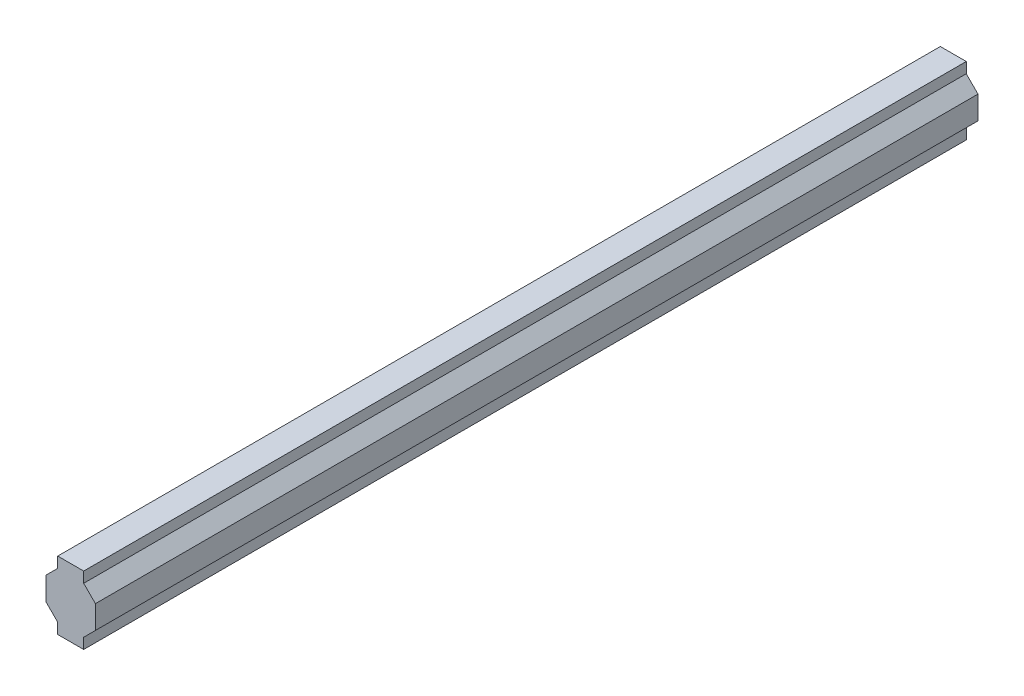
ISO-10303-21;
HEADER;
FILE_DESCRIPTION(('STEP AP214'),'2;1');
FILE_NAME('part.step','',(''),(''),'','','');
FILE_SCHEMA(('AUTOMOTIVE_DESIGN { 1 0 10303 214 1 1 1 1 }'));
ENDSEC;
DATA;
#1=APPLICATION_CONTEXT('core data for automotive mechanical design processes');
#2=APPLICATION_PROTOCOL_DEFINITION('international standard','automotive_design',2000,#1);
#3=PRODUCT_CONTEXT('',#1,'mechanical');
#4=PRODUCT('Part','Part','',(#3));
#5=PRODUCT_RELATED_PRODUCT_CATEGORY('part','',(#4));
#6=PRODUCT_DEFINITION_FORMATION('','',#4);
#7=PRODUCT_DEFINITION_CONTEXT('part definition',#1,'design');
#8=PRODUCT_DEFINITION('design','',#6,#7);
#9=PRODUCT_DEFINITION_SHAPE('','',#8);
#10=(LENGTH_UNIT() NAMED_UNIT(*) SI_UNIT(.MILLI.,.METRE.));
#11=(NAMED_UNIT(*) PLANE_ANGLE_UNIT() SI_UNIT($,.RADIAN.));
#12=(NAMED_UNIT(*) SI_UNIT($,.STERADIAN.) SOLID_ANGLE_UNIT());
#13=UNCERTAINTY_MEASURE_WITH_UNIT(LENGTH_MEASURE(1.E-05),#10,'distance_accuracy_value','');
#14=(GEOMETRIC_REPRESENTATION_CONTEXT(3) GLOBAL_UNCERTAINTY_ASSIGNED_CONTEXT((#13)) GLOBAL_UNIT_ASSIGNED_CONTEXT((#10,
#11,#12)) REPRESENTATION_CONTEXT('',''));
#15=CARTESIAN_POINT('',(0.,0.,0.));
#16=DIRECTION('',(0.,0.,1.));
#17=DIRECTION('',(1.,0.,0.));
#18=AXIS2_PLACEMENT_3D('',#15,#16,#17);
#19=CARTESIAN_POINT('',(-39.550290087148,0.0297695452971111,316.106580091162));
#20=DIRECTION('',(1.,0.,0.));
#21=DIRECTION('',(0.,0.,-1.));
#22=AXIS2_PLACEMENT_3D('',#19,#20,#21);
#23=PLANE('',#22);
#24=DIRECTION('',(0.,-1.,0.));
#25=VECTOR('',#24,1.);
#26=CARTESIAN_POINT('',(-39.550290087148,0.0297695452971111,116.106580091162));
#27=LINE('',#26,#25);
#28=CARTESIAN_POINT('',(-39.550290087148,5.29423563936438,116.106580091162));
#29=VERTEX_POINT('',#28);
#30=CARTESIAN_POINT('',(-39.550290087148,0.0297695452971111,116.106580091162));
#31=VERTEX_POINT('',#30);
#32=EDGE_CURVE('E157',#29,#31,#27,.T.);
#33=ORIENTED_EDGE('',*,*,#32,.T.);
#34=DIRECTION('',(0.,0.,-1.));
#35=VECTOR('',#34,1.);
#36=CARTESIAN_POINT('',(-39.550290087148,0.0297695452971111,316.106580091162));
#37=LINE('',#36,#35);
#38=CARTESIAN_POINT('',(-39.550290087148,0.0297695452971111,316.106580091162));
#39=VERTEX_POINT('',#38);
#40=EDGE_CURVE('E11',#39,#31,#37,.T.);
#41=ORIENTED_EDGE('',*,*,#40,.F.);
#42=DIRECTION('',(0.,-1.,0.));
#43=VECTOR('',#42,1.);
#44=CARTESIAN_POINT('',(-39.550290087148,0.0297695452971111,316.106580091162));
#45=LINE('',#44,#43);
#46=CARTESIAN_POINT('',(-39.550290087148,5.29423563936438,316.106580091162));
#47=VERTEX_POINT('',#46);
#48=EDGE_CURVE('E179',#47,#39,#45,.T.);
#49=ORIENTED_EDGE('',*,*,#48,.F.);
#50=DIRECTION('',(0.,0.,-1.));
#51=VECTOR('',#50,1.);
#52=CARTESIAN_POINT('',(-39.550290087148,5.29423563936438,316.106580091162));
#53=LINE('',#52,#51);
#54=EDGE_CURVE('E153',#47,#29,#53,.T.);
#55=ORIENTED_EDGE('',*,*,#54,.T.);
#56=EDGE_LOOP('',(#33,#41,#49,#55));
#57=FACE_BOUND('',#56,.T.);
#58=ADVANCED_FACE('F37',(#57),#23,.F.);
#59=CARTESIAN_POINT('',(-36.8896299153682,-2.63089062648271,316.106580091162));
#60=DIRECTION('',(0.707106781186547,0.707106781186547,0.));
#61=DIRECTION('',(-0.707106781186548,0.707106781186548,0.));
#62=AXIS2_PLACEMENT_3D('',#59,#60,#61);
#63=PLANE('',#62);
#64=DIRECTION('',(0.707106781186547,-0.707106781186547,0.));
#65=VECTOR('',#64,1.);
#66=CARTESIAN_POINT('',(-36.8896299153682,-2.63089062648271,116.106580091162));
#67=LINE('',#66,#65);
#68=CARTESIAN_POINT('',(-36.8896299153682,-2.63089062648271,116.106580091162));
#69=VERTEX_POINT('',#68);
#70=EDGE_CURVE('E160',#31,#69,#67,.T.);
#71=ORIENTED_EDGE('',*,*,#70,.T.);
#72=DIRECTION('',(0.,0.,-1.));
#73=VECTOR('',#72,1.);
#74=CARTESIAN_POINT('',(-36.8896299153682,-2.63089062648271,316.106580091162));
#75=LINE('',#74,#73);
#76=CARTESIAN_POINT('',(-36.8896299153682,-2.63089062648271,316.106580091162));
#77=VERTEX_POINT('',#76);
#78=EDGE_CURVE('E45',#77,#69,#75,.T.);
#79=ORIENTED_EDGE('',*,*,#78,.F.);
#80=DIRECTION('',(0.707106781186547,-0.707106781186547,0.));
#81=VECTOR('',#80,1.);
#82=CARTESIAN_POINT('',(-36.8896299153682,-2.63089062648271,316.106580091162));
#83=LINE('',#82,#81);
#84=EDGE_CURVE('E108',#39,#77,#83,.T.);
#85=ORIENTED_EDGE('',*,*,#84,.F.);
#86=ORIENTED_EDGE('',*,*,#40,.T.);
#87=EDGE_LOOP('',(#71,#79,#85,#86));
#88=FACE_BOUND('',#87,.T.);
#89=ADVANCED_FACE('F257',(#88),#63,.F.);
#90=CARTESIAN_POINT('',(-36.8896299153682,-5.03799740766926,316.106580091162));
#91=DIRECTION('',(1.,0.,0.));
#92=DIRECTION('',(0.,0.,-1.));
#93=AXIS2_PLACEMENT_3D('',#90,#91,#92);
#94=PLANE('',#93);
#95=DIRECTION('',(0.,-1.,0.));
#96=VECTOR('',#95,1.);
#97=CARTESIAN_POINT('',(-36.8896299153682,-5.03799740766926,116.106580091162));
#98=LINE('',#97,#96);
#99=CARTESIAN_POINT('',(-36.8896299153682,-5.03799740766926,116.106580091162));
#100=VERTEX_POINT('',#99);
#101=EDGE_CURVE('E162',#69,#100,#98,.T.);
#102=ORIENTED_EDGE('',*,*,#101,.T.);
#103=DIRECTION('',(0.,0.,-1.));
#104=VECTOR('',#103,1.);
#105=CARTESIAN_POINT('',(-36.8896299153682,-5.03799740766926,316.106580091162));
#106=LINE('',#105,#104);
#107=CARTESIAN_POINT('',(-36.8896299153682,-5.03799740766926,316.106580091162));
#108=VERTEX_POINT('',#107);
#109=EDGE_CURVE('E198',#108,#100,#106,.T.);
#110=ORIENTED_EDGE('',*,*,#109,.F.);
#111=DIRECTION('',(0.,-1.,0.));
#112=VECTOR('',#111,1.);
#113=CARTESIAN_POINT('',(-36.8896299153682,-5.03799740766926,316.106580091162));
#114=LINE('',#113,#112);
#115=EDGE_CURVE('E206',#77,#108,#114,.T.);
#116=ORIENTED_EDGE('',*,*,#115,.F.);
#117=ORIENTED_EDGE('',*,*,#78,.T.);
#118=EDGE_LOOP('',(#102,#110,#116,#117));
#119=FACE_BOUND('',#118,.T.);
#120=ADVANCED_FACE('F204',(#119),#94,.F.);
#121=CARTESIAN_POINT('',(-31.0109502589278,-5.03799740766925,316.106580091162));
#122=DIRECTION('',(0.,1.,0.));
#123=DIRECTION('',(-1.,0.,0.));
#124=AXIS2_PLACEMENT_3D('',#121,#122,#123);
#125=PLANE('',#124);
#126=DIRECTION('',(1.,0.,0.));
#127=VECTOR('',#126,1.);
#128=CARTESIAN_POINT('',(-31.0109502589278,-5.03799740766925,116.106580091162));
#129=LINE('',#128,#127);
#130=CARTESIAN_POINT('',(-31.0109502589278,-5.03799740766925,116.106580091162));
#131=VERTEX_POINT('',#130);
#132=EDGE_CURVE('E164',#100,#131,#129,.T.);
#133=ORIENTED_EDGE('',*,*,#132,.T.);
#134=DIRECTION('',(0.,0.,-1.));
#135=VECTOR('',#134,1.);
#136=CARTESIAN_POINT('',(-31.0109502589278,-5.03799740766925,316.106580091162));
#137=LINE('',#136,#135);
#138=CARTESIAN_POINT('',(-31.0109502589278,-5.03799740766925,316.106580091162));
#139=VERTEX_POINT('',#138);
#140=EDGE_CURVE('E195',#139,#131,#137,.T.);
#141=ORIENTED_EDGE('',*,*,#140,.F.);
#142=DIRECTION('',(1.,0.,0.));
#143=VECTOR('',#142,1.);
#144=CARTESIAN_POINT('',(-31.0109502589278,-5.03799740766925,316.106580091162));
#145=LINE('',#144,#143);
#146=EDGE_CURVE('E224',#108,#139,#145,.T.);
#147=ORIENTED_EDGE('',*,*,#146,.F.);
#148=ORIENTED_EDGE('',*,*,#109,.T.);
#149=EDGE_LOOP('',(#133,#141,#147,#148));
#150=FACE_BOUND('',#149,.T.);
#151=ADVANCED_FACE('F215',(#150),#125,.F.);
#152=CARTESIAN_POINT('',(-31.0109502589278,-2.63089062648273,316.106580091162));
#153=DIRECTION('',(-1.,0.,0.));
#154=DIRECTION('',(0.,0.,1.));
#155=AXIS2_PLACEMENT_3D('',#152,#153,#154);
#156=PLANE('',#155);
#157=DIRECTION('',(0.,1.,0.));
#158=VECTOR('',#157,1.);
#159=CARTESIAN_POINT('',(-31.0109502589278,-2.63089062648273,116.106580091162));
#160=LINE('',#159,#158);
#161=CARTESIAN_POINT('',(-31.0109502589278,-2.63089062648273,116.106580091162));
#162=VERTEX_POINT('',#161);
#163=EDGE_CURVE('E166',#131,#162,#160,.T.);
#164=ORIENTED_EDGE('',*,*,#163,.T.);
#165=DIRECTION('',(0.,0.,-1.));
#166=VECTOR('',#165,1.);
#167=CARTESIAN_POINT('',(-31.0109502589278,-2.63089062648273,316.106580091162));
#168=LINE('',#167,#166);
#169=CARTESIAN_POINT('',(-31.0109502589278,-2.63089062648273,316.106580091162));
#170=VERTEX_POINT('',#169);
#171=EDGE_CURVE('E192',#170,#162,#168,.T.);
#172=ORIENTED_EDGE('',*,*,#171,.F.);
#173=DIRECTION('',(0.,1.,0.));
#174=VECTOR('',#173,1.);
#175=CARTESIAN_POINT('',(-31.0109502589278,-2.63089062648273,316.106580091162));
#176=LINE('',#175,#174);
#177=EDGE_CURVE('E221',#139,#170,#176,.T.);
#178=ORIENTED_EDGE('',*,*,#177,.F.);
#179=ORIENTED_EDGE('',*,*,#140,.T.);
#180=EDGE_LOOP('',(#164,#172,#178,#179));
#181=FACE_BOUND('',#180,.T.);
#182=ADVANCED_FACE('F219',(#181),#156,.F.);
#183=CARTESIAN_POINT('',(-28.350290087148,0.0297695452971137,316.106580091162));
#184=DIRECTION('',(-0.707106781186548,0.707106781186548,0.));
#185=DIRECTION('',(-0.707106781186548,-0.707106781186548,0.));
#186=AXIS2_PLACEMENT_3D('',#183,#184,#185);
#187=PLANE('',#186);
#188=DIRECTION('',(0.707106781186548,0.707106781186548,0.));
#189=VECTOR('',#188,1.);
#190=CARTESIAN_POINT('',(-28.350290087148,0.0297695452971137,116.106580091162));
#191=LINE('',#190,#189);
#192=CARTESIAN_POINT('',(-28.350290087148,0.0297695452971137,116.106580091162));
#193=VERTEX_POINT('',#192);
#194=EDGE_CURVE('E168',#162,#193,#191,.T.);
#195=ORIENTED_EDGE('',*,*,#194,.T.);
#196=DIRECTION('',(0.,0.,-1.));
#197=VECTOR('',#196,1.);
#198=CARTESIAN_POINT('',(-28.350290087148,0.0297695452971137,316.106580091162));
#199=LINE('',#198,#197);
#200=CARTESIAN_POINT('',(-28.350290087148,0.0297695452971137,316.106580091162));
#201=VERTEX_POINT('',#200);
#202=EDGE_CURVE('E189',#201,#193,#199,.T.);
#203=ORIENTED_EDGE('',*,*,#202,.F.);
#204=DIRECTION('',(0.707106781186548,0.707106781186548,0.));
#205=VECTOR('',#204,1.);
#206=CARTESIAN_POINT('',(-28.350290087148,0.0297695452971137,316.106580091162));
#207=LINE('',#206,#205);
#208=EDGE_CURVE('E223',#170,#201,#207,.T.);
#209=ORIENTED_EDGE('',*,*,#208,.F.);
#210=ORIENTED_EDGE('',*,*,#171,.T.);
#211=EDGE_LOOP('',(#195,#203,#209,#210));
#212=FACE_BOUND('',#211,.T.);
#213=ADVANCED_FACE('F270',(#212),#187,.F.);
#214=CARTESIAN_POINT('',(-28.350290087148,5.29423563936437,316.106580091162));
#215=DIRECTION('',(-1.,0.,0.));
#216=DIRECTION('',(0.,0.,1.));
#217=AXIS2_PLACEMENT_3D('',#214,#215,#216);
#218=PLANE('',#217);
#219=DIRECTION('',(0.,1.,0.));
#220=VECTOR('',#219,1.);
#221=CARTESIAN_POINT('',(-28.350290087148,5.29423563936437,116.106580091162));
#222=LINE('',#221,#220);
#223=CARTESIAN_POINT('',(-28.350290087148,5.29423563936437,116.106580091162));
#224=VERTEX_POINT('',#223);
#225=EDGE_CURVE('E170',#193,#224,#222,.T.);
#226=ORIENTED_EDGE('',*,*,#225,.T.);
#227=DIRECTION('',(0.,0.,-1.));
#228=VECTOR('',#227,1.);
#229=CARTESIAN_POINT('',(-28.350290087148,5.29423563936437,316.106580091162));
#230=LINE('',#229,#228);
#231=CARTESIAN_POINT('',(-28.350290087148,5.29423563936437,316.106580091162));
#232=VERTEX_POINT('',#231);
#233=EDGE_CURVE('E186',#232,#224,#230,.T.);
#234=ORIENTED_EDGE('',*,*,#233,.F.);
#235=DIRECTION('',(0.,1.,0.));
#236=VECTOR('',#235,1.);
#237=CARTESIAN_POINT('',(-28.350290087148,5.29423563936437,316.106580091162));
#238=LINE('',#237,#236);
#239=EDGE_CURVE('E226',#201,#232,#238,.T.);
#240=ORIENTED_EDGE('',*,*,#239,.F.);
#241=ORIENTED_EDGE('',*,*,#202,.T.);
#242=EDGE_LOOP('',(#226,#234,#240,#241));
#243=FACE_BOUND('',#242,.T.);
#244=ADVANCED_FACE('F273',(#243),#218,.F.);
#245=CARTESIAN_POINT('',(-31.0109502589278,7.95489581114419,316.106580091162));
#246=DIRECTION('',(-0.707106781186547,-0.707106781186547,0.));
#247=DIRECTION('',(0.707106781186548,-0.707106781186548,0.));
#248=AXIS2_PLACEMENT_3D('',#245,#246,#247);
#249=PLANE('',#248);
#250=DIRECTION('',(-0.707106781186547,0.707106781186547,0.));
#251=VECTOR('',#250,1.);
#252=CARTESIAN_POINT('',(-31.0109502589278,7.95489581114419,116.106580091162));
#253=LINE('',#252,#251);
#254=CARTESIAN_POINT('',(-31.0109502589278,7.95489581114419,116.106580091162));
#255=VERTEX_POINT('',#254);
#256=EDGE_CURVE('E172',#224,#255,#253,.T.);
#257=ORIENTED_EDGE('',*,*,#256,.T.);
#258=DIRECTION('',(0.,0.,-1.));
#259=VECTOR('',#258,1.);
#260=CARTESIAN_POINT('',(-31.0109502589278,7.95489581114419,316.106580091162));
#261=LINE('',#260,#259);
#262=CARTESIAN_POINT('',(-31.0109502589278,7.95489581114419,316.106580091162));
#263=VERTEX_POINT('',#262);
#264=EDGE_CURVE('E183',#263,#255,#261,.T.);
#265=ORIENTED_EDGE('',*,*,#264,.F.);
#266=DIRECTION('',(-0.707106781186547,0.707106781186547,0.));
#267=VECTOR('',#266,1.);
#268=CARTESIAN_POINT('',(-31.0109502589278,7.95489581114419,316.106580091162));
#269=LINE('',#268,#267);
#270=EDGE_CURVE('E232',#232,#263,#269,.T.);
#271=ORIENTED_EDGE('',*,*,#270,.F.);
#272=ORIENTED_EDGE('',*,*,#233,.T.);
#273=EDGE_LOOP('',(#257,#265,#271,#272));
#274=FACE_BOUND('',#273,.T.);
#275=ADVANCED_FACE('F238',(#274),#249,.F.);
#276=CARTESIAN_POINT('',(-31.0109502589278,10.3620025923307,316.106580091162));
#277=DIRECTION('',(-1.,0.,0.));
#278=DIRECTION('',(0.,0.,1.));
#279=AXIS2_PLACEMENT_3D('',#276,#277,#278);
#280=PLANE('',#279);
#281=DIRECTION('',(0.,1.,0.));
#282=VECTOR('',#281,1.);
#283=CARTESIAN_POINT('',(-31.0109502589278,10.3620025923307,116.106580091162));
#284=LINE('',#283,#282);
#285=CARTESIAN_POINT('',(-31.0109502589278,10.3620025923307,116.106580091162));
#286=VERTEX_POINT('',#285);
#287=EDGE_CURVE('E174',#255,#286,#284,.T.);
#288=ORIENTED_EDGE('',*,*,#287,.T.);
#289=DIRECTION('',(0.,0.,-1.));
#290=VECTOR('',#289,1.);
#291=CARTESIAN_POINT('',(-31.0109502589278,10.3620025923307,316.106580091162));
#292=LINE('',#291,#290);
#293=CARTESIAN_POINT('',(-31.0109502589278,10.3620025923307,316.106580091162));
#294=VERTEX_POINT('',#293);
#295=EDGE_CURVE('E148',#294,#286,#292,.T.);
#296=ORIENTED_EDGE('',*,*,#295,.F.);
#297=DIRECTION('',(0.,1.,0.));
#298=VECTOR('',#297,1.);
#299=CARTESIAN_POINT('',(-31.0109502589278,10.3620025923307,316.106580091162));
#300=LINE('',#299,#298);
#301=EDGE_CURVE('E139',#263,#294,#300,.T.);
#302=ORIENTED_EDGE('',*,*,#301,.F.);
#303=ORIENTED_EDGE('',*,*,#264,.T.);
#304=EDGE_LOOP('',(#288,#296,#302,#303));
#305=FACE_BOUND('',#304,.T.);
#306=ADVANCED_FACE('F242',(#305),#280,.F.);
#307=CARTESIAN_POINT('',(-36.8896299153682,10.3620025923307,316.106580091162));
#308=DIRECTION('',(0.,-1.,0.));
#309=DIRECTION('',(0.,0.,-1.));
#310=AXIS2_PLACEMENT_3D('',#307,#308,#309);
#311=PLANE('',#310);
#312=DIRECTION('',(-1.,0.,0.));
#313=VECTOR('',#312,1.);
#314=CARTESIAN_POINT('',(-36.8896299153682,10.3620025923307,116.106580091162));
#315=LINE('',#314,#313);
#316=CARTESIAN_POINT('',(-36.8896299153682,10.3620025923307,116.106580091162));
#317=VERTEX_POINT('',#316);
#318=EDGE_CURVE('E147',#286,#317,#315,.T.);
#319=ORIENTED_EDGE('',*,*,#318,.T.);
#320=DIRECTION('',(0.,0.,-1.));
#321=VECTOR('',#320,1.);
#322=CARTESIAN_POINT('',(-36.8896299153682,10.3620025923307,316.106580091162));
#323=LINE('',#322,#321);
#324=CARTESIAN_POINT('',(-36.8896299153682,10.3620025923307,316.106580091162));
#325=VERTEX_POINT('',#324);
#326=EDGE_CURVE('E144',#325,#317,#323,.T.);
#327=ORIENTED_EDGE('',*,*,#326,.F.);
#328=DIRECTION('',(-1.,0.,0.));
#329=VECTOR('',#328,1.);
#330=CARTESIAN_POINT('',(-36.8896299153682,10.3620025923307,316.106580091162));
#331=LINE('',#330,#329);
#332=EDGE_CURVE('E133',#294,#325,#331,.T.);
#333=ORIENTED_EDGE('',*,*,#332,.F.);
#334=ORIENTED_EDGE('',*,*,#295,.T.);
#335=EDGE_LOOP('',(#319,#327,#333,#334));
#336=FACE_BOUND('',#335,.T.);
#337=ADVANCED_FACE('F145',(#336),#311,.F.);
#338=CARTESIAN_POINT('',(-36.8896299153682,7.9548958111442,316.106580091162));
#339=DIRECTION('',(1.,0.,0.));
#340=DIRECTION('',(0.,0.,-1.));
#341=AXIS2_PLACEMENT_3D('',#338,#339,#340);
#342=PLANE('',#341);
#343=DIRECTION('',(0.,-1.,0.));
#344=VECTOR('',#343,1.);
#345=CARTESIAN_POINT('',(-36.8896299153682,7.9548958111442,116.106580091162));
#346=LINE('',#345,#344);
#347=CARTESIAN_POINT('',(-36.8896299153682,7.9548958111442,116.106580091162));
#348=VERTEX_POINT('',#347);
#349=EDGE_CURVE('E94',#317,#348,#346,.T.);
#350=ORIENTED_EDGE('',*,*,#349,.T.);
#351=DIRECTION('',(0.,0.,-1.));
#352=VECTOR('',#351,1.);
#353=CARTESIAN_POINT('',(-36.8896299153682,7.9548958111442,316.106580091162));
#354=LINE('',#353,#352);
#355=CARTESIAN_POINT('',(-36.8896299153682,7.9548958111442,316.106580091162));
#356=VERTEX_POINT('',#355);
#357=EDGE_CURVE('E149',#356,#348,#354,.T.);
#358=ORIENTED_EDGE('',*,*,#357,.F.);
#359=DIRECTION('',(0.,-1.,0.));
#360=VECTOR('',#359,1.);
#361=CARTESIAN_POINT('',(-36.8896299153682,7.9548958111442,316.106580091162));
#362=LINE('',#361,#360);
#363=EDGE_CURVE('E137',#325,#356,#362,.T.);
#364=ORIENTED_EDGE('',*,*,#363,.F.);
#365=ORIENTED_EDGE('',*,*,#326,.T.);
#366=EDGE_LOOP('',(#350,#358,#364,#365));
#367=FACE_BOUND('',#366,.T.);
#368=ADVANCED_FACE('F151',(#367),#342,.F.);
#369=CARTESIAN_POINT('',(-39.550290087148,5.29423563936438,316.106580091162));
#370=DIRECTION('',(0.707106781186547,-0.707106781186547,0.));
#371=DIRECTION('',(0.707106781186548,0.707106781186548,0.));
#372=AXIS2_PLACEMENT_3D('',#369,#370,#371);
#373=PLANE('',#372);
#374=DIRECTION('',(-0.707106781186547,-0.707106781186547,0.));
#375=VECTOR('',#374,1.);
#376=CARTESIAN_POINT('',(-39.550290087148,5.29423563936438,116.106580091162));
#377=LINE('',#376,#375);
#378=EDGE_CURVE('E100',#348,#29,#377,.T.);
#379=ORIENTED_EDGE('',*,*,#378,.T.);
#380=ORIENTED_EDGE('',*,*,#54,.F.);
#381=DIRECTION('',(-0.707106781186547,-0.707106781186547,0.));
#382=VECTOR('',#381,1.);
#383=CARTESIAN_POINT('',(-39.550290087148,5.29423563936438,316.106580091162));
#384=LINE('',#383,#382);
#385=EDGE_CURVE('E53',#356,#47,#384,.T.);
#386=ORIENTED_EDGE('',*,*,#385,.F.);
#387=ORIENTED_EDGE('',*,*,#357,.T.);
#388=EDGE_LOOP('',(#379,#380,#386,#387));
#389=FACE_BOUND('',#388,.T.);
#390=ADVANCED_FACE('F246',(#389),#373,.F.);
#391=CARTESIAN_POINT('',(0.,0.,316.106580091162));
#392=DIRECTION('',(0.,0.,-1.));
#393=DIRECTION('',(-1.,0.,0.));
#394=AXIS2_PLACEMENT_3D('',#391,#392,#393);
#395=PLANE('',#394);
#396=ORIENTED_EDGE('',*,*,#48,.T.);
#397=ORIENTED_EDGE('',*,*,#84,.T.);
#398=ORIENTED_EDGE('',*,*,#115,.T.);
#399=ORIENTED_EDGE('',*,*,#146,.T.);
#400=ORIENTED_EDGE('',*,*,#177,.T.);
#401=ORIENTED_EDGE('',*,*,#208,.T.);
#402=ORIENTED_EDGE('',*,*,#239,.T.);
#403=ORIENTED_EDGE('',*,*,#270,.T.);
#404=ORIENTED_EDGE('',*,*,#301,.T.);
#405=ORIENTED_EDGE('',*,*,#332,.T.);
#406=ORIENTED_EDGE('',*,*,#363,.T.);
#407=ORIENTED_EDGE('',*,*,#385,.T.);
#408=EDGE_LOOP('',(#396,#397,#398,#399,#400,#401,#402,#403,#404,#405,#406,#407));
#409=FACE_BOUND('',#408,.T.);
#410=ADVANCED_FACE('F135',(#409),#395,.F.);
#411=CARTESIAN_POINT('',(0.,0.,116.106580091162));
#412=DIRECTION('',(0.,0.,-1.));
#413=DIRECTION('',(-1.,0.,0.));
#414=AXIS2_PLACEMENT_3D('',#411,#412,#413);
#415=PLANE('',#414);
#416=ORIENTED_EDGE('',*,*,#32,.F.);
#417=ORIENTED_EDGE('',*,*,#378,.F.);
#418=ORIENTED_EDGE('',*,*,#349,.F.);
#419=ORIENTED_EDGE('',*,*,#318,.F.);
#420=ORIENTED_EDGE('',*,*,#287,.F.);
#421=ORIENTED_EDGE('',*,*,#256,.F.);
#422=ORIENTED_EDGE('',*,*,#225,.F.);
#423=ORIENTED_EDGE('',*,*,#194,.F.);
#424=ORIENTED_EDGE('',*,*,#163,.F.);
#425=ORIENTED_EDGE('',*,*,#132,.F.);
#426=ORIENTED_EDGE('',*,*,#101,.F.);
#427=ORIENTED_EDGE('',*,*,#70,.F.);
#428=EDGE_LOOP('',(#416,#417,#418,#419,#420,#421,#422,#423,#424,#425,#426,#427));
#429=FACE_BOUND('',#428,.T.);
#430=ADVANCED_FACE('F210',(#429),#415,.T.);
#431=CLOSED_SHELL('',(#58,#89,#120,#151,#182,#213,#244,#275,#306,#337,#368,#390,#410,#430));
#432=MANIFOLD_SOLID_BREP('B2',#431);
#433=ADVANCED_BREP_SHAPE_REPRESENTATION('',(#18,#432),#14);
#434=SHAPE_DEFINITION_REPRESENTATION(#9,#433);
ENDSEC;
END-ISO-10303-21;
